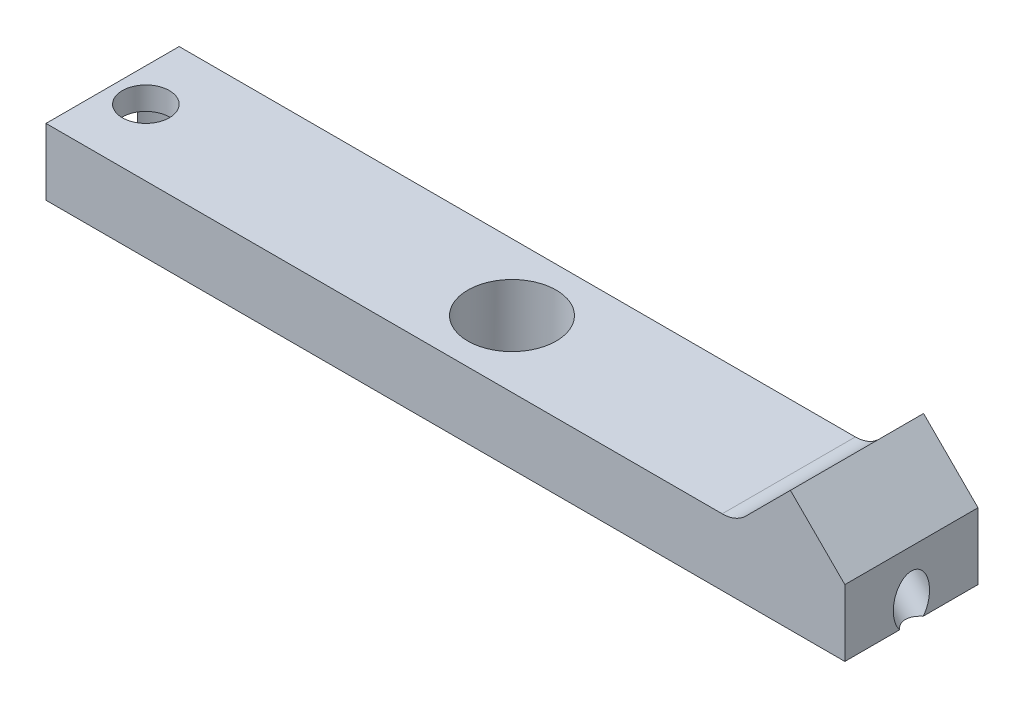
ISO-10303-21;
HEADER;
FILE_DESCRIPTION(('STEP AP214'),'2;1');
FILE_NAME('part.step','',(''),(''),'','','');
FILE_SCHEMA(('AUTOMOTIVE_DESIGN { 1 0 10303 214 1 1 1 1 }'));
ENDSEC;
DATA;
#1=APPLICATION_CONTEXT('core data for automotive mechanical design processes');
#2=APPLICATION_PROTOCOL_DEFINITION('international standard','automotive_design',2000,#1);
#3=PRODUCT_CONTEXT('',#1,'mechanical');
#4=PRODUCT('Part','Part','',(#3));
#5=PRODUCT_RELATED_PRODUCT_CATEGORY('part','',(#4));
#6=PRODUCT_DEFINITION_FORMATION('','',#4);
#7=PRODUCT_DEFINITION_CONTEXT('part definition',#1,'design');
#8=PRODUCT_DEFINITION('design','',#6,#7);
#9=PRODUCT_DEFINITION_SHAPE('','',#8);
#10=(LENGTH_UNIT() NAMED_UNIT(*) SI_UNIT(.MILLI.,.METRE.));
#11=(NAMED_UNIT(*) PLANE_ANGLE_UNIT() SI_UNIT($,.RADIAN.));
#12=(NAMED_UNIT(*) SI_UNIT($,.STERADIAN.) SOLID_ANGLE_UNIT());
#13=UNCERTAINTY_MEASURE_WITH_UNIT(LENGTH_MEASURE(1.E-05),#10,'distance_accuracy_value','');
#14=(GEOMETRIC_REPRESENTATION_CONTEXT(3) GLOBAL_UNCERTAINTY_ASSIGNED_CONTEXT((#13)) GLOBAL_UNIT_ASSIGNED_CONTEXT((#10,
#11,#12)) REPRESENTATION_CONTEXT('',''));
#15=CARTESIAN_POINT('',(0.,0.,0.));
#16=DIRECTION('',(0.,0.,1.));
#17=DIRECTION('',(1.,0.,0.));
#18=AXIS2_PLACEMENT_3D('',#15,#16,#17);
#19=CARTESIAN_POINT('',(-38.1,3.175,6.35));
#20=DIRECTION('',(-1.,0.,0.));
#21=DIRECTION('',(0.,0.,1.));
#22=AXIS2_PLACEMENT_3D('',#19,#20,#21);
#23=PLANE('',#22);
#24=DIRECTION('',(0.,-1.,0.));
#25=VECTOR('',#24,1.);
#26=CARTESIAN_POINT('',(-38.1,-3.175,-2.38125));
#27=LINE('',#26,#25);
#28=CARTESIAN_POINT('',(-38.1,0.9906,-2.38125));
#29=VERTEX_POINT('',#28);
#30=CARTESIAN_POINT('',(-38.1,-3.175,-2.38125));
#31=VERTEX_POINT('',#30);
#32=EDGE_CURVE('E180',#29,#31,#27,.T.);
#33=ORIENTED_EDGE('',*,*,#32,.F.);
#34=DIRECTION('',(0.,0.,-1.));
#35=VECTOR('',#34,1.);
#36=CARTESIAN_POINT('',(-38.1,0.9906,6.35));
#37=LINE('',#36,#35);
#38=CARTESIAN_POINT('',(-38.1,0.9906,2.38125));
#39=VERTEX_POINT('',#38);
#40=EDGE_CURVE('E129',#39,#29,#37,.T.);
#41=ORIENTED_EDGE('',*,*,#40,.F.);
#42=DIRECTION('',(0.,-1.,0.));
#43=VECTOR('',#42,1.);
#44=CARTESIAN_POINT('',(-38.1,-3.175,2.38125));
#45=LINE('',#44,#43);
#46=CARTESIAN_POINT('',(-38.1,-3.175,2.38125));
#47=VERTEX_POINT('',#46);
#48=EDGE_CURVE('E243',#47,#39,#45,.F.);
#49=ORIENTED_EDGE('',*,*,#48,.F.);
#50=DIRECTION('',(0.,0.,-1.));
#51=VECTOR('',#50,1.);
#52=CARTESIAN_POINT('',(-38.1,-3.175,6.35));
#53=LINE('',#52,#51);
#54=CARTESIAN_POINT('',(-38.1,-3.175,6.35));
#55=VERTEX_POINT('',#54);
#56=EDGE_CURVE('E207',#55,#47,#53,.T.);
#57=ORIENTED_EDGE('',*,*,#56,.F.);
#58=DIRECTION('',(0.,-1.,0.));
#59=VECTOR('',#58,1.);
#60=CARTESIAN_POINT('',(-38.1,3.175,6.35));
#61=LINE('',#60,#59);
#62=CARTESIAN_POINT('',(-38.1,3.175,6.35));
#63=VERTEX_POINT('',#62);
#64=EDGE_CURVE('E159',#63,#55,#61,.T.);
#65=ORIENTED_EDGE('',*,*,#64,.F.);
#66=DIRECTION('',(0.,0.,-1.));
#67=VECTOR('',#66,1.);
#68=CARTESIAN_POINT('',(-38.1,3.175,6.35));
#69=LINE('',#68,#67);
#70=CARTESIAN_POINT('',(-38.1,3.175,-6.35));
#71=VERTEX_POINT('',#70);
#72=EDGE_CURVE('E153',#63,#71,#69,.T.);
#73=ORIENTED_EDGE('',*,*,#72,.T.);
#74=DIRECTION('',(0.,-1.,0.));
#75=VECTOR('',#74,1.);
#76=CARTESIAN_POINT('',(-38.1,3.175,-6.35));
#77=LINE('',#76,#75);
#78=CARTESIAN_POINT('',(-38.1,-3.175,-6.35));
#79=VERTEX_POINT('',#78);
#80=EDGE_CURVE('E169',#71,#79,#77,.T.);
#81=ORIENTED_EDGE('',*,*,#80,.T.);
#82=EDGE_CURVE('E210',#31,#79,#53,.T.);
#83=ORIENTED_EDGE('',*,*,#82,.F.);
#84=EDGE_LOOP('',(#33,#41,#49,#57,#65,#73,#81,#83));
#85=FACE_BOUND('',#84,.T.);
#86=ADVANCED_FACE('F42',(#85),#23,.T.);
#87=CARTESIAN_POINT('',(-38.1,3.175,6.35));
#88=DIRECTION('',(0.,0.,-1.));
#89=DIRECTION('',(-1.,0.,0.));
#90=AXIS2_PLACEMENT_3D('',#87,#88,#89);
#91=PLANE('',#90);
#92=DIRECTION('',(1.,0.,0.));
#93=VECTOR('',#92,1.);
#94=CARTESIAN_POINT('',(-38.1,-3.175,6.35));
#95=LINE('',#94,#93);
#96=CARTESIAN_POINT('',(38.1,-3.175,6.35));
#97=VERTEX_POINT('',#96);
#98=EDGE_CURVE('E149',#55,#97,#95,.T.);
#99=ORIENTED_EDGE('',*,*,#98,.T.);
#100=DIRECTION('',(0.,-1.,0.));
#101=VECTOR('',#100,1.);
#102=CARTESIAN_POINT('',(38.1,3.175,6.35));
#103=LINE('',#102,#101);
#104=CARTESIAN_POINT('',(38.1,3.175,6.35));
#105=VERTEX_POINT('',#104);
#106=EDGE_CURVE('E147',#105,#97,#103,.T.);
#107=ORIENTED_EDGE('',*,*,#106,.F.);
#108=DIRECTION('',(-0.707106781186547,0.707106781186547,0.));
#109=VECTOR('',#108,1.);
#110=CARTESIAN_POINT('',(38.1,3.175,6.35));
#111=LINE('',#110,#109);
#112=CARTESIAN_POINT('',(32.9078440093033,8.36715599069671,6.35));
#113=VERTEX_POINT('',#112);
#114=EDGE_CURVE('E234',#105,#113,#111,.T.);
#115=ORIENTED_EDGE('',*,*,#114,.T.);
#116=DIRECTION('',(-0.707106781186547,-0.707106781186547,0.));
#117=VECTOR('',#116,1.);
#118=CARTESIAN_POINT('',(32.9078440093033,8.36715599069671,6.35));
#119=LINE('',#118,#117);
#120=CARTESIAN_POINT('',(28.6456239883393,4.10493596973271,6.35));
#121=VERTEX_POINT('',#120);
#122=EDGE_CURVE('E228',#113,#121,#119,.T.);
#123=ORIENTED_EDGE('',*,*,#122,.T.);
#124=CARTESIAN_POINT('',(26.400559958072,6.35,6.35));
#125=DIRECTION('',(0.,0.,-1.));
#126=DIRECTION('',(-1.,0.,0.));
#127=AXIS2_PLACEMENT_3D('',#124,#125,#126);
#128=CIRCLE('',#127,3.175);
#129=CARTESIAN_POINT('',(26.400559958072,3.175,6.35));
#130=VERTEX_POINT('',#129);
#131=EDGE_CURVE('E11',#121,#130,#128,.T.);
#132=ORIENTED_EDGE('',*,*,#131,.T.);
#133=DIRECTION('',(1.,0.,0.));
#134=VECTOR('',#133,1.);
#135=CARTESIAN_POINT('',(-38.1,3.175,6.35));
#136=LINE('',#135,#134);
#137=EDGE_CURVE('E173',#63,#130,#136,.T.);
#138=ORIENTED_EDGE('',*,*,#137,.F.);
#139=ORIENTED_EDGE('',*,*,#64,.T.);
#140=EDGE_LOOP('',(#99,#107,#115,#123,#132,#138,#139));
#141=FACE_BOUND('',#140,.T.);
#142=ADVANCED_FACE('F268',(#141),#91,.F.);
#143=CARTESIAN_POINT('',(38.1,3.175,6.35));
#144=DIRECTION('',(-1.,0.,0.));
#145=DIRECTION('',(0.,0.,1.));
#146=AXIS2_PLACEMENT_3D('',#143,#144,#145);
#147=PLANE('',#146);
#148=DIRECTION('',(0.,0.,-1.));
#149=VECTOR('',#148,1.);
#150=CARTESIAN_POINT('',(38.1,-3.175,6.35));
#151=LINE('',#150,#149);
#152=CARTESIAN_POINT('',(38.1,-3.175,1.11966871189382));
#153=VERTEX_POINT('',#152);
#154=EDGE_CURVE('E136',#97,#153,#151,.T.);
#155=ORIENTED_EDGE('',*,*,#154,.T.);
#156=CARTESIAN_POINT('',(38.1,-1.31512806053428,0.));
#157=DIRECTION('',(-1.,0.,0.));
#158=DIRECTION('',(0.,1.,0.));
#159=AXIS2_PLACEMENT_3D('',#156,#157,#158);
#160=ELLIPSE('',#159,2.4426296649308,1.72719999999999);
#161=CARTESIAN_POINT('',(38.1,-3.175,-1.11966871189383));
#162=VERTEX_POINT('',#161);
#163=EDGE_CURVE('E119',#153,#162,#160,.T.);
#164=ORIENTED_EDGE('',*,*,#163,.T.);
#165=CARTESIAN_POINT('',(38.1,-3.175,-6.35));
#166=VERTEX_POINT('',#165);
#167=EDGE_CURVE('E138',#162,#166,#151,.T.);
#168=ORIENTED_EDGE('',*,*,#167,.T.);
#169=DIRECTION('',(0.,-1.,0.));
#170=VECTOR('',#169,1.);
#171=CARTESIAN_POINT('',(38.1,3.175,-6.35));
#172=LINE('',#171,#170);
#173=CARTESIAN_POINT('',(38.1,3.175,-6.35));
#174=VERTEX_POINT('',#173);
#175=EDGE_CURVE('E165',#174,#166,#172,.T.);
#176=ORIENTED_EDGE('',*,*,#175,.F.);
#177=DIRECTION('',(0.,0.,-1.));
#178=VECTOR('',#177,1.);
#179=CARTESIAN_POINT('',(38.1,3.175,6.35));
#180=LINE('',#179,#178);
#181=EDGE_CURVE('E192',#105,#174,#180,.T.);
#182=ORIENTED_EDGE('',*,*,#181,.F.);
#183=ORIENTED_EDGE('',*,*,#106,.T.);
#184=EDGE_LOOP('',(#155,#164,#168,#176,#182,#183));
#185=FACE_BOUND('',#184,.T.);
#186=ADVANCED_FACE('F144',(#185),#147,.F.);
#187=CARTESIAN_POINT('',(-38.1,3.175,-6.35));
#188=DIRECTION('',(0.,0.,-1.));
#189=DIRECTION('',(-1.,0.,0.));
#190=AXIS2_PLACEMENT_3D('',#187,#188,#189);
#191=PLANE('',#190);
#192=DIRECTION('',(1.,0.,0.));
#193=VECTOR('',#192,1.);
#194=CARTESIAN_POINT('',(-38.1,-3.175,-6.35));
#195=LINE('',#194,#193);
#196=EDGE_CURVE('E155',#79,#166,#195,.T.);
#197=ORIENTED_EDGE('',*,*,#196,.F.);
#198=ORIENTED_EDGE('',*,*,#80,.F.);
#199=DIRECTION('',(1.,0.,0.));
#200=VECTOR('',#199,1.);
#201=CARTESIAN_POINT('',(-38.1,3.175,-6.35));
#202=LINE('',#201,#200);
#203=CARTESIAN_POINT('',(26.400559958072,3.175,-6.35));
#204=VERTEX_POINT('',#203);
#205=EDGE_CURVE('E196',#71,#204,#202,.T.);
#206=ORIENTED_EDGE('',*,*,#205,.T.);
#207=CARTESIAN_POINT('',(26.400559958072,6.35,-6.35));
#208=DIRECTION('',(0.,0.,-1.));
#209=DIRECTION('',(-1.,0.,0.));
#210=AXIS2_PLACEMENT_3D('',#207,#208,#209);
#211=CIRCLE('',#210,3.175);
#212=CARTESIAN_POINT('',(28.6456239883393,4.10493596973271,-6.35));
#213=VERTEX_POINT('',#212);
#214=EDGE_CURVE('E51',#204,#213,#211,.F.);
#215=ORIENTED_EDGE('',*,*,#214,.T.);
#216=DIRECTION('',(-0.707106781186547,-0.707106781186547,0.));
#217=VECTOR('',#216,1.);
#218=CARTESIAN_POINT('',(32.9078440093033,8.36715599069671,-6.35));
#219=LINE('',#218,#217);
#220=CARTESIAN_POINT('',(32.9078440093033,8.36715599069671,-6.35));
#221=VERTEX_POINT('',#220);
#222=EDGE_CURVE('E231',#221,#213,#219,.T.);
#223=ORIENTED_EDGE('',*,*,#222,.F.);
#224=DIRECTION('',(-0.707106781186547,0.707106781186547,0.));
#225=VECTOR('',#224,1.);
#226=CARTESIAN_POINT('',(38.1,3.175,-6.35));
#227=LINE('',#226,#225);
#228=EDGE_CURVE('E179',#174,#221,#227,.T.);
#229=ORIENTED_EDGE('',*,*,#228,.F.);
#230=ORIENTED_EDGE('',*,*,#175,.T.);
#231=EDGE_LOOP('',(#197,#198,#206,#215,#223,#229,#230));
#232=FACE_BOUND('',#231,.T.);
#233=ADVANCED_FACE('F273',(#232),#191,.T.);
#234=CARTESIAN_POINT('',(0.,3.175,0.));
#235=DIRECTION('',(0.,-1.,0.));
#236=DIRECTION('',(0.,0.,-1.));
#237=AXIS2_PLACEMENT_3D('',#234,#235,#236);
#238=PLANE('',#237);
#239=CARTESIAN_POINT('',(-34.925,3.175,0.));
#240=DIRECTION('',(0.,-1.,0.));
#241=DIRECTION('',(0.,0.,-1.));
#242=AXIS2_PLACEMENT_3D('',#239,#240,#241);
#243=CIRCLE('',#242,2.2479);
#244=CARTESIAN_POINT('',(-34.925,3.175,-2.2479));
#245=VERTEX_POINT('',#244);
#246=EDGE_CURVE('E176',#245,#245,#243,.T.);
#247=ORIENTED_EDGE('',*,*,#246,.T.);
#248=EDGE_LOOP('',(#247));
#249=FACE_BOUND('',#248,.T.);
#250=CARTESIAN_POINT('',(0.,3.175,0.));
#251=DIRECTION('',(0.,1.,0.));
#252=DIRECTION('',(0.,0.,1.));
#253=AXIS2_PLACEMENT_3D('',#250,#251,#252);
#254=CIRCLE('',#253,4.2164);
#255=CARTESIAN_POINT('',(0.,3.175,4.2164));
#256=VERTEX_POINT('',#255);
#257=EDGE_CURVE('E218',#256,#256,#254,.T.);
#258=ORIENTED_EDGE('',*,*,#257,.F.);
#259=EDGE_LOOP('',(#258));
#260=FACE_BOUND('',#259,.T.);
#261=ORIENTED_EDGE('',*,*,#137,.T.);
#262=DIRECTION('',(0.,0.,-1.));
#263=VECTOR('',#262,1.);
#264=CARTESIAN_POINT('',(26.400559958072,3.175,-6.35));
#265=LINE('',#264,#263);
#266=EDGE_CURVE('E128',#130,#204,#265,.T.);
#267=ORIENTED_EDGE('',*,*,#266,.T.);
#268=ORIENTED_EDGE('',*,*,#205,.F.);
#269=ORIENTED_EDGE('',*,*,#72,.F.);
#270=EDGE_LOOP('',(#261,#267,#268,#269));
#271=FACE_BOUND('',#270,.T.);
#272=ADVANCED_FACE('F270',(#249,#260,#271),#238,.F.);
#273=CARTESIAN_POINT('',(0.,-3.175,0.));
#274=DIRECTION('',(0.,-1.,0.));
#275=DIRECTION('',(0.,0.,-1.));
#276=AXIS2_PLACEMENT_3D('',#273,#274,#275);
#277=PLANE('',#276);
#278=CARTESIAN_POINT('',(39.9598719394657,-3.175,0.));
#279=DIRECTION('',(0.,-1.,0.));
#280=DIRECTION('',(-1.,0.,0.));
#281=AXIS2_PLACEMENT_3D('',#278,#279,#280);
#282=ELLIPSE('',#281,2.4426296649308,1.72719999999999);
#283=EDGE_CURVE('E123',#153,#162,#282,.T.);
#284=ORIENTED_EDGE('',*,*,#283,.F.);
#285=ORIENTED_EDGE('',*,*,#154,.F.);
#286=ORIENTED_EDGE('',*,*,#98,.F.);
#287=ORIENTED_EDGE('',*,*,#56,.T.);
#288=CARTESIAN_POINT('',(-34.925,-3.175,0.));
#289=DIRECTION('',(0.,-1.,0.));
#290=DIRECTION('',(0.,0.,-1.));
#291=AXIS2_PLACEMENT_3D('',#288,#289,#290);
#292=CIRCLE('',#291,3.96875);
#293=EDGE_CURVE('E162',#31,#47,#292,.T.);
#294=ORIENTED_EDGE('',*,*,#293,.F.);
#295=ORIENTED_EDGE('',*,*,#82,.T.);
#296=ORIENTED_EDGE('',*,*,#196,.T.);
#297=ORIENTED_EDGE('',*,*,#167,.F.);
#298=EDGE_LOOP('',(#284,#285,#286,#287,#294,#295,#296,#297));
#299=FACE_BOUND('',#298,.T.);
#300=CARTESIAN_POINT('',(0.,-3.175,0.));
#301=DIRECTION('',(0.,-1.,0.));
#302=DIRECTION('',(0.,0.,-1.));
#303=AXIS2_PLACEMENT_3D('',#300,#301,#302);
#304=CIRCLE('',#303,4.2164);
#305=CARTESIAN_POINT('',(0.,-3.175,-4.2164));
#306=VERTEX_POINT('',#305);
#307=EDGE_CURVE('E205',#306,#306,#304,.T.);
#308=ORIENTED_EDGE('',*,*,#307,.F.);
#309=EDGE_LOOP('',(#308));
#310=FACE_BOUND('',#309,.T.);
#311=ADVANCED_FACE('F133',(#299,#310),#277,.T.);
#312=CARTESIAN_POINT('',(0.,3.175,0.));
#313=DIRECTION('',(0.,1.,0.));
#314=DIRECTION('',(0.,0.,1.));
#315=AXIS2_PLACEMENT_3D('',#312,#313,#314);
#316=CYLINDRICAL_SURFACE('',#315,4.2164);
#317=ORIENTED_EDGE('',*,*,#307,.T.);
#318=EDGE_LOOP('',(#317));
#319=FACE_BOUND('',#318,.T.);
#320=ORIENTED_EDGE('',*,*,#257,.T.);
#321=EDGE_LOOP('',(#320));
#322=FACE_BOUND('',#321,.T.);
#323=ADVANCED_FACE('F299',(#319,#322),#316,.F.);
#324=CARTESIAN_POINT('',(38.1,3.175,6.35));
#325=DIRECTION('',(-0.707106781186548,-0.707106781186548,0.));
#326=DIRECTION('',(0.707106781186548,-0.707106781186547,0.));
#327=AXIS2_PLACEMENT_3D('',#324,#325,#326);
#328=PLANE('',#327);
#329=ORIENTED_EDGE('',*,*,#228,.T.);
#330=DIRECTION('',(0.,0.,-1.));
#331=VECTOR('',#330,1.);
#332=CARTESIAN_POINT('',(32.9078440093033,8.36715599069671,6.35));
#333=LINE('',#332,#331);
#334=EDGE_CURVE('E223',#113,#221,#333,.T.);
#335=ORIENTED_EDGE('',*,*,#334,.F.);
#336=ORIENTED_EDGE('',*,*,#114,.F.);
#337=ORIENTED_EDGE('',*,*,#181,.T.);
#338=EDGE_LOOP('',(#329,#335,#336,#337));
#339=FACE_BOUND('',#338,.T.);
#340=ADVANCED_FACE('F260',(#339),#328,.F.);
#341=CARTESIAN_POINT('',(32.9078440093033,8.36715599069671,6.35));
#342=DIRECTION('',(0.707106781186548,-0.707106781186548,0.));
#343=DIRECTION('',(0.707106781186548,0.707106781186547,0.));
#344=AXIS2_PLACEMENT_3D('',#341,#342,#343);
#345=PLANE('',#344);
#346=CARTESIAN_POINT('',(30.6627799790361,6.12209196042957,0.));
#347=DIRECTION('',(-0.707106781186547,0.707106781186548,0.));
#348=DIRECTION('',(-0.707106781186548,-0.707106781186547,0.));
#349=AXIS2_PLACEMENT_3D('',#346,#347,#348);
#350=CIRCLE('',#349,1.72719999999999);
#351=CARTESIAN_POINT('',(29.4414651465707,4.90077712796417,0.));
#352=VERTEX_POINT('',#351);
#353=EDGE_CURVE('E141',#352,#352,#350,.T.);
#354=ORIENTED_EDGE('',*,*,#353,.F.);
#355=EDGE_LOOP('',(#354));
#356=FACE_BOUND('',#355,.T.);
#357=ORIENTED_EDGE('',*,*,#222,.T.);
#358=DIRECTION('',(0.,0.,-1.));
#359=VECTOR('',#358,1.);
#360=CARTESIAN_POINT('',(28.6456239883393,4.10493596973271,6.35));
#361=LINE('',#360,#359);
#362=EDGE_CURVE('E58',#213,#121,#361,.F.);
#363=ORIENTED_EDGE('',*,*,#362,.T.);
#364=ORIENTED_EDGE('',*,*,#122,.F.);
#365=ORIENTED_EDGE('',*,*,#334,.T.);
#366=EDGE_LOOP('',(#357,#363,#364,#365));
#367=FACE_BOUND('',#366,.T.);
#368=ADVANCED_FACE('F257',(#356,#367),#345,.F.);
#369=CARTESIAN_POINT('',(-34.925,-3.175,0.));
#370=DIRECTION('',(0.,-1.,0.));
#371=DIRECTION('',(0.,0.,-1.));
#372=AXIS2_PLACEMENT_3D('',#369,#370,#371);
#373=CYLINDRICAL_SURFACE('',#372,2.2479);
#374=CARTESIAN_POINT('',(-34.925,0.9906,0.));
#375=DIRECTION('',(0.,-1.,0.));
#376=DIRECTION('',(0.,0.,-1.));
#377=AXIS2_PLACEMENT_3D('',#374,#375,#376);
#378=CIRCLE('',#377,2.2479);
#379=CARTESIAN_POINT('',(-34.925,0.9906,-2.2479));
#380=VERTEX_POINT('',#379);
#381=EDGE_CURVE('E246',#380,#380,#378,.T.);
#382=ORIENTED_EDGE('',*,*,#381,.T.);
#383=EDGE_LOOP('',(#382));
#384=FACE_BOUND('',#383,.T.);
#385=ORIENTED_EDGE('',*,*,#246,.F.);
#386=EDGE_LOOP('',(#385));
#387=FACE_BOUND('',#386,.T.);
#388=ADVANCED_FACE('F259',(#384,#387),#373,.F.);
#389=CARTESIAN_POINT('',(-32.6771,0.9906,0.));
#390=DIRECTION('',(0.,1.,0.));
#391=DIRECTION('',(0.,0.,1.));
#392=AXIS2_PLACEMENT_3D('',#389,#390,#391);
#393=PLANE('',#392);
#394=ORIENTED_EDGE('',*,*,#40,.T.);
#395=CARTESIAN_POINT('',(-34.925,0.9906,0.));
#396=DIRECTION('',(0.,-1.,0.));
#397=DIRECTION('',(0.,0.,-1.));
#398=AXIS2_PLACEMENT_3D('',#395,#396,#397);
#399=CIRCLE('',#398,3.96875);
#400=EDGE_CURVE('E140',#29,#39,#399,.T.);
#401=ORIENTED_EDGE('',*,*,#400,.T.);
#402=EDGE_LOOP('',(#394,#401));
#403=FACE_BOUND('',#402,.T.);
#404=ORIENTED_EDGE('',*,*,#381,.F.);
#405=EDGE_LOOP('',(#404));
#406=FACE_BOUND('',#405,.T.);
#407=ADVANCED_FACE('F281',(#403,#406),#393,.F.);
#408=CARTESIAN_POINT('',(-34.925,-3.175,0.));
#409=DIRECTION('',(0.,-1.,0.));
#410=DIRECTION('',(0.,0.,-1.));
#411=AXIS2_PLACEMENT_3D('',#408,#409,#410);
#412=CYLINDRICAL_SURFACE('',#411,3.96875);
#413=ORIENTED_EDGE('',*,*,#32,.T.);
#414=ORIENTED_EDGE('',*,*,#293,.T.);
#415=ORIENTED_EDGE('',*,*,#48,.T.);
#416=ORIENTED_EDGE('',*,*,#400,.F.);
#417=EDGE_LOOP('',(#413,#414,#415,#416));
#418=FACE_BOUND('',#417,.T.);
#419=ADVANCED_FACE('F279',(#418),#412,.F.);
#420=CARTESIAN_POINT('',(30.6627799790361,6.12209196042957,0.));
#421=DIRECTION('',(-0.707106781186547,0.707106781186548,0.));
#422=DIRECTION('',(-0.707106781186548,-0.707106781186547,0.));
#423=AXIS2_PLACEMENT_3D('',#420,#421,#422);
#424=CYLINDRICAL_SURFACE('',#423,1.72719999999999);
#425=ORIENTED_EDGE('',*,*,#283,.T.);
#426=ORIENTED_EDGE('',*,*,#163,.F.);
#427=EDGE_LOOP('',(#425,#426));
#428=FACE_BOUND('',#427,.T.);
#429=ORIENTED_EDGE('',*,*,#353,.T.);
#430=EDGE_LOOP('',(#429));
#431=FACE_BOUND('',#430,.T.);
#432=ADVANCED_FACE('F121',(#428,#431),#424,.F.);
#433=CARTESIAN_POINT('',(26.400559958072,6.35,0.));
#434=DIRECTION('',(0.,0.,1.));
#435=DIRECTION('',(1.,0.,0.));
#436=AXIS2_PLACEMENT_3D('',#433,#434,#435);
#437=CYLINDRICAL_SURFACE('',#436,3.175);
#438=ORIENTED_EDGE('',*,*,#131,.F.);
#439=ORIENTED_EDGE('',*,*,#362,.F.);
#440=ORIENTED_EDGE('',*,*,#214,.F.);
#441=ORIENTED_EDGE('',*,*,#266,.F.);
#442=EDGE_LOOP('',(#438,#439,#440,#441));
#443=FACE_BOUND('',#442,.T.);
#444=ADVANCED_FACE('F44',(#443),#437,.F.);
#445=CLOSED_SHELL('',(#86,#142,#186,#233,#272,#311,#323,#340,#368,#388,#407,#419,#432,#444));
#446=MANIFOLD_SOLID_BREP('B2',#445);
#447=ADVANCED_BREP_SHAPE_REPRESENTATION('',(#18,#446),#14);
#448=SHAPE_DEFINITION_REPRESENTATION(#9,#447);
ENDSEC;
END-ISO-10303-21;
